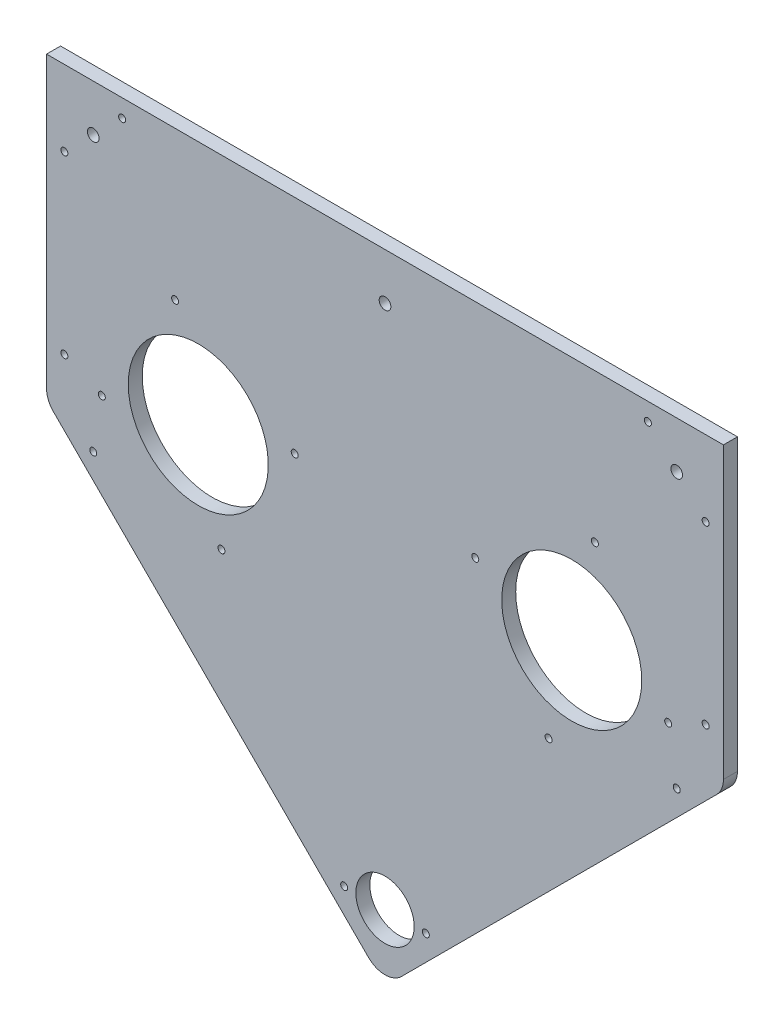
ISO-10303-21;
HEADER;
FILE_DESCRIPTION(('STEP AP214'),'2;1');
FILE_NAME('part.step','',(''),(''),'','','');
FILE_SCHEMA(('AUTOMOTIVE_DESIGN { 1 0 10303 214 1 1 1 1 }'));
ENDSEC;
DATA;
#1=APPLICATION_CONTEXT('core data for automotive mechanical design processes');
#2=APPLICATION_PROTOCOL_DEFINITION('international standard','automotive_design',2000,#1);
#3=PRODUCT_CONTEXT('',#1,'mechanical');
#4=PRODUCT('Part','Part','',(#3));
#5=PRODUCT_RELATED_PRODUCT_CATEGORY('part','',(#4));
#6=PRODUCT_DEFINITION_FORMATION('','',#4);
#7=PRODUCT_DEFINITION_CONTEXT('part definition',#1,'design');
#8=PRODUCT_DEFINITION('design','',#6,#7);
#9=PRODUCT_DEFINITION_SHAPE('','',#8);
#10=(LENGTH_UNIT() NAMED_UNIT(*) SI_UNIT(.MILLI.,.METRE.));
#11=(NAMED_UNIT(*) PLANE_ANGLE_UNIT() SI_UNIT($,.RADIAN.));
#12=(NAMED_UNIT(*) SI_UNIT($,.STERADIAN.) SOLID_ANGLE_UNIT());
#13=UNCERTAINTY_MEASURE_WITH_UNIT(LENGTH_MEASURE(1.E-05),#10,'distance_accuracy_value','');
#14=(GEOMETRIC_REPRESENTATION_CONTEXT(3) GLOBAL_UNCERTAINTY_ASSIGNED_CONTEXT((#13)) GLOBAL_UNIT_ASSIGNED_CONTEXT((#10,
#11,#12)) REPRESENTATION_CONTEXT('',''));
#15=CARTESIAN_POINT('',(0.,0.,0.));
#16=DIRECTION('',(0.,0.,1.));
#17=DIRECTION('',(1.,0.,0.));
#18=AXIS2_PLACEMENT_3D('',#15,#16,#17);
#19=CARTESIAN_POINT('',(0.,0.,6.));
#20=DIRECTION('',(0.,0.,-1.));
#21=DIRECTION('',(-1.,0.,0.));
#22=AXIS2_PLACEMENT_3D('',#19,#20,#21);
#23=PLANE('',#22);
#24=CARTESIAN_POINT('',(80.,15.,6.));
#25=DIRECTION('',(0.,0.,1.));
#26=DIRECTION('',(1.,0.,0.));
#27=AXIS2_PLACEMENT_3D('',#24,#25,#26);
#28=CIRCLE('',#27,30.);
#29=CARTESIAN_POINT('',(110.,15.,6.));
#30=VERTEX_POINT('',#29);
#31=EDGE_CURVE('E754',#30,#30,#28,.T.);
#32=ORIENTED_EDGE('',*,*,#31,.F.);
#33=EDGE_LOOP('',(#32));
#34=FACE_BOUND('',#33,.T.);
#35=CARTESIAN_POINT('',(-89.9203681970796,56.3259760300271,6.));
#36=DIRECTION('',(0.,0.,1.));
#37=DIRECTION('',(-1.,0.,0.));
#38=AXIS2_PLACEMENT_3D('',#35,#36,#37);
#39=CIRCLE('',#38,1.50000000000003);
#40=CARTESIAN_POINT('',(-91.4203681970796,56.3259760300271,6.));
#41=VERTEX_POINT('',#40);
#42=EDGE_CURVE('E758',#41,#41,#39,.T.);
#43=ORIENTED_EDGE('',*,*,#42,.F.);
#44=EDGE_LOOP('',(#43));
#45=FACE_BOUND('',#44,.T.);
#46=CARTESIAN_POINT('',(-70.0796318029204,-26.3259760300271,6.));
#47=DIRECTION('',(0.,0.,1.));
#48=DIRECTION('',(-1.,0.,0.));
#49=AXIS2_PLACEMENT_3D('',#46,#47,#48);
#50=CIRCLE('',#49,1.5);
#51=CARTESIAN_POINT('',(-71.5796318029204,-26.3259760300271,6.));
#52=VERTEX_POINT('',#51);
#53=EDGE_CURVE('E762',#52,#52,#50,.T.);
#54=ORIENTED_EDGE('',*,*,#53,.F.);
#55=EDGE_LOOP('',(#54));
#56=FACE_BOUND('',#55,.T.);
#57=CARTESIAN_POINT('',(-121.325976030027,5.07963180292047,6.));
#58=DIRECTION('',(0.,0.,1.));
#59=DIRECTION('',(-1.,0.,0.));
#60=AXIS2_PLACEMENT_3D('',#57,#58,#59);
#61=CIRCLE('',#60,1.5);
#62=CARTESIAN_POINT('',(-122.825976030027,5.07963180292047,6.));
#63=VERTEX_POINT('',#62);
#64=EDGE_CURVE('E766',#63,#63,#61,.T.);
#65=ORIENTED_EDGE('',*,*,#64,.F.);
#66=EDGE_LOOP('',(#65));
#67=FACE_BOUND('',#66,.T.);
#68=CARTESIAN_POINT('',(38.6740239699729,24.9203681970796,6.));
#69=DIRECTION('',(0.,0.,1.));
#70=DIRECTION('',(1.,0.,0.));
#71=AXIS2_PLACEMENT_3D('',#68,#69,#70);
#72=CIRCLE('',#71,1.50000000000003);
#73=CARTESIAN_POINT('',(40.1740239699729,24.9203681970796,6.));
#74=VERTEX_POINT('',#73);
#75=EDGE_CURVE('E740',#74,#74,#72,.T.);
#76=ORIENTED_EDGE('',*,*,#75,.F.);
#77=EDGE_LOOP('',(#76));
#78=FACE_BOUND('',#77,.T.);
#79=CARTESIAN_POINT('',(121.325976030027,5.07963180292047,6.));
#80=DIRECTION('',(0.,0.,1.));
#81=DIRECTION('',(1.,0.,0.));
#82=AXIS2_PLACEMENT_3D('',#79,#80,#81);
#83=CIRCLE('',#82,1.5);
#84=CARTESIAN_POINT('',(122.825976030027,5.07963180292047,6.));
#85=VERTEX_POINT('',#84);
#86=EDGE_CURVE('E743',#85,#85,#83,.T.);
#87=ORIENTED_EDGE('',*,*,#86,.F.);
#88=EDGE_LOOP('',(#87));
#89=FACE_BOUND('',#88,.T.);
#90=CARTESIAN_POINT('',(70.0796318029204,-26.3259760300271,6.));
#91=DIRECTION('',(0.,0.,1.));
#92=DIRECTION('',(1.,0.,0.));
#93=AXIS2_PLACEMENT_3D('',#90,#91,#92);
#94=CIRCLE('',#93,1.5);
#95=CARTESIAN_POINT('',(71.5796318029204,-26.3259760300271,6.));
#96=VERTEX_POINT('',#95);
#97=EDGE_CURVE('E748',#96,#96,#94,.T.);
#98=ORIENTED_EDGE('',*,*,#97,.F.);
#99=EDGE_LOOP('',(#98));
#100=FACE_BOUND('',#99,.T.);
#101=CARTESIAN_POINT('',(-38.6740239699729,24.9203681970796,6.));
#102=DIRECTION('',(0.,0.,1.));
#103=DIRECTION('',(-1.,0.,0.));
#104=AXIS2_PLACEMENT_3D('',#101,#102,#103);
#105=CIRCLE('',#104,1.50000000000003);
#106=CARTESIAN_POINT('',(-40.1740239699729,24.9203681970796,6.));
#107=VERTEX_POINT('',#106);
#108=EDGE_CURVE('E750',#107,#107,#105,.T.);
#109=ORIENTED_EDGE('',*,*,#108,.F.);
#110=EDGE_LOOP('',(#109));
#111=FACE_BOUND('',#110,.T.);
#112=CARTESIAN_POINT('',(-80.,15.,6.));
#113=DIRECTION('',(0.,0.,1.));
#114=DIRECTION('',(-1.,0.,0.));
#115=AXIS2_PLACEMENT_3D('',#112,#113,#114);
#116=CIRCLE('',#115,30.);
#117=CARTESIAN_POINT('',(-110.,15.,6.));
#118=VERTEX_POINT('',#117);
#119=EDGE_CURVE('E770',#118,#118,#116,.T.);
#120=ORIENTED_EDGE('',*,*,#119,.F.);
#121=EDGE_LOOP('',(#120));
#122=FACE_BOUND('',#121,.T.);
#123=CARTESIAN_POINT('',(89.9203681970796,56.3259760300271,6.));
#124=DIRECTION('',(0.,0.,1.));
#125=DIRECTION('',(1.,0.,0.));
#126=AXIS2_PLACEMENT_3D('',#123,#124,#125);
#127=CIRCLE('',#126,1.50000000000003);
#128=CARTESIAN_POINT('',(91.4203681970796,56.3259760300271,6.));
#129=VERTEX_POINT('',#128);
#130=EDGE_CURVE('E200',#129,#129,#127,.T.);
#131=ORIENTED_EDGE('',*,*,#130,.F.);
#132=EDGE_LOOP('',(#131));
#133=FACE_BOUND('',#132,.T.);
#134=DIRECTION('',(0.,-1.,0.));
#135=VECTOR('',#134,1.);
#136=CARTESIAN_POINT('',(-145.,-8.28427124746189,6.));
#137=LINE('',#136,#135);
#138=CARTESIAN_POINT('',(-145.,120.,6.));
#139=VERTEX_POINT('',#138);
#140=CARTESIAN_POINT('',(-145.,-4.14213562373095,6.));
#141=VERTEX_POINT('',#140);
#142=EDGE_CURVE('E161',#139,#141,#137,.T.);
#143=ORIENTED_EDGE('',*,*,#142,.T.);
#144=CARTESIAN_POINT('',(-135.,-4.14213562373095,6.));
#145=DIRECTION('',(0.,0.,-1.));
#146=DIRECTION('',(-1.,0.,0.));
#147=AXIS2_PLACEMENT_3D('',#144,#145,#146);
#148=CIRCLE('',#147,10.);
#149=CARTESIAN_POINT('',(-142.071067811865,-11.2132034355965,6.));
#150=VERTEX_POINT('',#149);
#151=EDGE_CURVE('E186',#141,#150,#148,.F.);
#152=ORIENTED_EDGE('',*,*,#151,.T.);
#153=DIRECTION('',(0.707106781186547,-0.707106781186547,0.));
#154=VECTOR('',#153,1.);
#155=CARTESIAN_POINT('',(0.,-153.284271247462,6.));
#156=LINE('',#155,#154);
#157=CARTESIAN_POINT('',(-7.07106781186548,-146.213203435596,6.));
#158=VERTEX_POINT('',#157);
#159=EDGE_CURVE('E353',#150,#158,#156,.T.);
#160=ORIENTED_EDGE('',*,*,#159,.T.);
#161=CARTESIAN_POINT('',(0.,-139.142135623731,6.));
#162=DIRECTION('',(0.,0.,-1.));
#163=DIRECTION('',(-1.,0.,0.));
#164=AXIS2_PLACEMENT_3D('',#161,#162,#163);
#165=CIRCLE('',#164,10.);
#166=CARTESIAN_POINT('',(7.07106781186545,-146.213203435596,6.));
#167=VERTEX_POINT('',#166);
#168=EDGE_CURVE('E181',#158,#167,#165,.F.);
#169=ORIENTED_EDGE('',*,*,#168,.T.);
#170=DIRECTION('',(0.707106781186548,0.707106781186547,0.));
#171=VECTOR('',#170,1.);
#172=CARTESIAN_POINT('',(145.,-8.28427124746206,6.));
#173=LINE('',#172,#171);
#174=CARTESIAN_POINT('',(142.071067811865,-11.2132034355966,6.));
#175=VERTEX_POINT('',#174);
#176=EDGE_CURVE('E123',#167,#175,#173,.T.);
#177=ORIENTED_EDGE('',*,*,#176,.T.);
#178=CARTESIAN_POINT('',(135.,-4.14213562373111,6.));
#179=DIRECTION('',(0.,0.,-1.));
#180=DIRECTION('',(-1.,0.,0.));
#181=AXIS2_PLACEMENT_3D('',#178,#179,#180);
#182=CIRCLE('',#181,10.);
#183=CARTESIAN_POINT('',(145.,-4.14213562373111,6.));
#184=VERTEX_POINT('',#183);
#185=EDGE_CURVE('E65',#175,#184,#182,.F.);
#186=ORIENTED_EDGE('',*,*,#185,.T.);
#187=DIRECTION('',(0.,1.,0.));
#188=VECTOR('',#187,1.);
#189=CARTESIAN_POINT('',(145.,120.,6.));
#190=LINE('',#189,#188);
#191=CARTESIAN_POINT('',(145.,120.,6.));
#192=VERTEX_POINT('',#191);
#193=EDGE_CURVE('E112',#184,#192,#190,.T.);
#194=ORIENTED_EDGE('',*,*,#193,.T.);
#195=DIRECTION('',(-1.,0.,0.));
#196=VECTOR('',#195,1.);
#197=CARTESIAN_POINT('',(-145.,120.,6.));
#198=LINE('',#197,#196);
#199=EDGE_CURVE('E117',#192,#139,#198,.T.);
#200=ORIENTED_EDGE('',*,*,#199,.T.);
#201=EDGE_LOOP('',(#143,#152,#160,#169,#177,#186,#194,#200));
#202=FACE_BOUND('',#201,.T.);
#203=CARTESIAN_POINT('',(-125.,100.,6.));
#204=DIRECTION('',(0.,0.,1.));
#205=DIRECTION('',(1.,0.,0.));
#206=AXIS2_PLACEMENT_3D('',#203,#204,#205);
#207=CIRCLE('',#206,2.5);
#208=CARTESIAN_POINT('',(-122.5,100.,6.));
#209=VERTEX_POINT('',#208);
#210=EDGE_CURVE('E150',#209,#209,#207,.T.);
#211=ORIENTED_EDGE('',*,*,#210,.F.);
#212=EDGE_LOOP('',(#211));
#213=FACE_BOUND('',#212,.T.);
#214=CARTESIAN_POINT('',(125.,100.,6.));
#215=DIRECTION('',(0.,0.,1.));
#216=DIRECTION('',(1.,0.,0.));
#217=AXIS2_PLACEMENT_3D('',#214,#215,#216);
#218=CIRCLE('',#217,2.49999999999998);
#219=CARTESIAN_POINT('',(127.5,100.,6.));
#220=VERTEX_POINT('',#219);
#221=EDGE_CURVE('E337',#220,#220,#218,.T.);
#222=ORIENTED_EDGE('',*,*,#221,.F.);
#223=EDGE_LOOP('',(#222));
#224=FACE_BOUND('',#223,.T.);
#225=CARTESIAN_POINT('',(0.,-125.,6.));
#226=DIRECTION('',(0.,0.,1.));
#227=DIRECTION('',(1.,0.,0.));
#228=AXIS2_PLACEMENT_3D('',#225,#226,#227);
#229=CIRCLE('',#228,12.5);
#230=CARTESIAN_POINT('',(12.5,-125.,6.));
#231=VERTEX_POINT('',#230);
#232=EDGE_CURVE('E329',#231,#231,#229,.T.);
#233=ORIENTED_EDGE('',*,*,#232,.F.);
#234=EDGE_LOOP('',(#233));
#235=FACE_BOUND('',#234,.T.);
#236=CARTESIAN_POINT('',(-112.625631329235,112.374368670765,6.));
#237=DIRECTION('',(0.,0.,1.));
#238=DIRECTION('',(1.,0.,0.));
#239=AXIS2_PLACEMENT_3D('',#236,#237,#238);
#240=CIRCLE('',#239,1.5);
#241=CARTESIAN_POINT('',(-111.125631329235,112.374368670765,6.));
#242=VERTEX_POINT('',#241);
#243=EDGE_CURVE('E321',#242,#242,#240,.T.);
#244=ORIENTED_EDGE('',*,*,#243,.F.);
#245=EDGE_LOOP('',(#244));
#246=FACE_BOUND('',#245,.T.);
#247=CARTESIAN_POINT('',(-137.374368670765,87.6256313292354,6.));
#248=DIRECTION('',(0.,0.,1.));
#249=DIRECTION('',(1.,0.,0.));
#250=AXIS2_PLACEMENT_3D('',#247,#248,#249);
#251=CIRCLE('',#250,1.5);
#252=CARTESIAN_POINT('',(-135.874368670765,87.6256313292354,6.));
#253=VERTEX_POINT('',#252);
#254=EDGE_CURVE('E313',#253,#253,#251,.T.);
#255=ORIENTED_EDGE('',*,*,#254,.F.);
#256=EDGE_LOOP('',(#255));
#257=FACE_BOUND('',#256,.T.);
#258=CARTESIAN_POINT('',(-137.374368670765,12.3743686707647,6.));
#259=DIRECTION('',(0.,0.,1.));
#260=DIRECTION('',(1.,0.,0.));
#261=AXIS2_PLACEMENT_3D('',#258,#259,#260);
#262=CIRCLE('',#261,1.5);
#263=CARTESIAN_POINT('',(-135.874368670765,12.3743686707647,6.));
#264=VERTEX_POINT('',#263);
#265=EDGE_CURVE('E305',#264,#264,#262,.T.);
#266=ORIENTED_EDGE('',*,*,#265,.F.);
#267=EDGE_LOOP('',(#266));
#268=FACE_BOUND('',#267,.T.);
#269=CARTESIAN_POINT('',(-125.,-17.5,6.));
#270=DIRECTION('',(0.,0.,1.));
#271=DIRECTION('',(1.,0.,0.));
#272=AXIS2_PLACEMENT_3D('',#269,#270,#271);
#273=CIRCLE('',#272,1.5);
#274=CARTESIAN_POINT('',(-123.5,-17.5,6.));
#275=VERTEX_POINT('',#274);
#276=EDGE_CURVE('E297',#275,#275,#273,.T.);
#277=ORIENTED_EDGE('',*,*,#276,.F.);
#278=EDGE_LOOP('',(#277));
#279=FACE_BOUND('',#278,.T.);
#280=CARTESIAN_POINT('',(-17.5,-125.,6.));
#281=DIRECTION('',(0.,0.,1.));
#282=DIRECTION('',(1.,0.,0.));
#283=AXIS2_PLACEMENT_3D('',#280,#281,#282);
#284=CIRCLE('',#283,1.5);
#285=CARTESIAN_POINT('',(-16.,-125.,6.));
#286=VERTEX_POINT('',#285);
#287=EDGE_CURVE('E289',#286,#286,#284,.T.);
#288=ORIENTED_EDGE('',*,*,#287,.F.);
#289=EDGE_LOOP('',(#288));
#290=FACE_BOUND('',#289,.T.);
#291=CARTESIAN_POINT('',(17.5,-125.,6.));
#292=DIRECTION('',(0.,0.,1.));
#293=DIRECTION('',(-1.,0.,0.));
#294=AXIS2_PLACEMENT_3D('',#291,#292,#293);
#295=CIRCLE('',#294,1.5);
#296=CARTESIAN_POINT('',(16.,-125.,6.));
#297=VERTEX_POINT('',#296);
#298=EDGE_CURVE('E281',#297,#297,#295,.T.);
#299=ORIENTED_EDGE('',*,*,#298,.F.);
#300=EDGE_LOOP('',(#299));
#301=FACE_BOUND('',#300,.T.);
#302=CARTESIAN_POINT('',(125.,-17.5,6.));
#303=DIRECTION('',(0.,0.,1.));
#304=DIRECTION('',(-1.,0.,0.));
#305=AXIS2_PLACEMENT_3D('',#302,#303,#304);
#306=CIRCLE('',#305,1.5);
#307=CARTESIAN_POINT('',(123.5,-17.5,6.));
#308=VERTEX_POINT('',#307);
#309=EDGE_CURVE('E273',#308,#308,#306,.T.);
#310=ORIENTED_EDGE('',*,*,#309,.F.);
#311=EDGE_LOOP('',(#310));
#312=FACE_BOUND('',#311,.T.);
#313=CARTESIAN_POINT('',(137.374368670765,12.3743686707647,6.));
#314=DIRECTION('',(0.,0.,1.));
#315=DIRECTION('',(-1.,0.,0.));
#316=AXIS2_PLACEMENT_3D('',#313,#314,#315);
#317=CIRCLE('',#316,1.5);
#318=CARTESIAN_POINT('',(135.874368670765,12.3743686707647,6.));
#319=VERTEX_POINT('',#318);
#320=EDGE_CURVE('E265',#319,#319,#317,.T.);
#321=ORIENTED_EDGE('',*,*,#320,.F.);
#322=EDGE_LOOP('',(#321));
#323=FACE_BOUND('',#322,.T.);
#324=CARTESIAN_POINT('',(137.374368670765,87.6256313292354,6.));
#325=DIRECTION('',(0.,0.,1.));
#326=DIRECTION('',(-1.,0.,0.));
#327=AXIS2_PLACEMENT_3D('',#324,#325,#326);
#328=CIRCLE('',#327,1.5);
#329=CARTESIAN_POINT('',(135.874368670765,87.6256313292354,6.));
#330=VERTEX_POINT('',#329);
#331=EDGE_CURVE('E257',#330,#330,#328,.T.);
#332=ORIENTED_EDGE('',*,*,#331,.F.);
#333=EDGE_LOOP('',(#332));
#334=FACE_BOUND('',#333,.T.);
#335=CARTESIAN_POINT('',(112.625631329235,112.374368670765,6.));
#336=DIRECTION('',(0.,0.,1.));
#337=DIRECTION('',(-1.,0.,0.));
#338=AXIS2_PLACEMENT_3D('',#335,#336,#337);
#339=CIRCLE('',#338,1.5);
#340=CARTESIAN_POINT('',(111.125631329235,112.374368670765,6.));
#341=VERTEX_POINT('',#340);
#342=EDGE_CURVE('E249',#341,#341,#339,.T.);
#343=ORIENTED_EDGE('',*,*,#342,.F.);
#344=EDGE_LOOP('',(#343));
#345=FACE_BOUND('',#344,.T.);
#346=CARTESIAN_POINT('',(0.,100.,6.));
#347=DIRECTION('',(0.,0.,1.));
#348=DIRECTION('',(1.,0.,0.));
#349=AXIS2_PLACEMENT_3D('',#346,#347,#348);
#350=CIRCLE('',#349,2.5);
#351=CARTESIAN_POINT('',(2.5,100.,6.));
#352=VERTEX_POINT('',#351);
#353=EDGE_CURVE('E239',#352,#352,#350,.T.);
#354=ORIENTED_EDGE('',*,*,#353,.F.);
#355=EDGE_LOOP('',(#354));
#356=FACE_BOUND('',#355,.T.);
#357=ADVANCED_FACE('F47',(#34,#45,#56,#67,#78,#89,#100,#111,#122,#133,#202,#213,#224,#235,#246,
#257,#268,#279,#290,#301,#312,#323,#334,#345,#356),#23,.F.);
#358=CARTESIAN_POINT('',(0.,0.,0.));
#359=DIRECTION('',(0.,0.,-1.));
#360=DIRECTION('',(-1.,0.,0.));
#361=AXIS2_PLACEMENT_3D('',#358,#359,#360);
#362=PLANE('',#361);
#363=CARTESIAN_POINT('',(80.,15.,0.));
#364=DIRECTION('',(0.,0.,-1.));
#365=DIRECTION('',(-1.,0.,0.));
#366=AXIS2_PLACEMENT_3D('',#363,#364,#365);
#367=CIRCLE('',#366,30.);
#368=CARTESIAN_POINT('',(50.,15.,0.));
#369=VERTEX_POINT('',#368);
#370=EDGE_CURVE('E51',#369,#369,#367,.T.);
#371=ORIENTED_EDGE('',*,*,#370,.F.);
#372=EDGE_LOOP('',(#371));
#373=FACE_BOUND('',#372,.T.);
#374=CARTESIAN_POINT('',(-89.9203681970796,56.3259760300271,0.));
#375=DIRECTION('',(0.,0.,-1.));
#376=DIRECTION('',(-1.,0.,0.));
#377=AXIS2_PLACEMENT_3D('',#374,#375,#376);
#378=CIRCLE('',#377,1.50000000000003);
#379=CARTESIAN_POINT('',(-91.4203681970796,56.3259760300271,0.));
#380=VERTEX_POINT('',#379);
#381=EDGE_CURVE('E227',#380,#380,#378,.T.);
#382=ORIENTED_EDGE('',*,*,#381,.F.);
#383=EDGE_LOOP('',(#382));
#384=FACE_BOUND('',#383,.T.);
#385=CARTESIAN_POINT('',(-70.0796318029204,-26.3259760300271,0.));
#386=DIRECTION('',(0.,0.,-1.));
#387=DIRECTION('',(-1.,0.,0.));
#388=AXIS2_PLACEMENT_3D('',#385,#386,#387);
#389=CIRCLE('',#388,1.5);
#390=CARTESIAN_POINT('',(-71.5796318029204,-26.3259760300271,0.));
#391=VERTEX_POINT('',#390);
#392=EDGE_CURVE('E224',#391,#391,#389,.T.);
#393=ORIENTED_EDGE('',*,*,#392,.F.);
#394=EDGE_LOOP('',(#393));
#395=FACE_BOUND('',#394,.T.);
#396=CARTESIAN_POINT('',(-121.325976030027,5.07963180292047,0.));
#397=DIRECTION('',(0.,0.,-1.));
#398=DIRECTION('',(-1.,0.,0.));
#399=AXIS2_PLACEMENT_3D('',#396,#397,#398);
#400=CIRCLE('',#399,1.5);
#401=CARTESIAN_POINT('',(-122.825976030027,5.07963180292047,0.));
#402=VERTEX_POINT('',#401);
#403=EDGE_CURVE('E220',#402,#402,#400,.T.);
#404=ORIENTED_EDGE('',*,*,#403,.F.);
#405=EDGE_LOOP('',(#404));
#406=FACE_BOUND('',#405,.T.);
#407=CARTESIAN_POINT('',(38.6740239699729,24.9203681970796,0.));
#408=DIRECTION('',(0.,0.,-1.));
#409=DIRECTION('',(-1.,0.,0.));
#410=AXIS2_PLACEMENT_3D('',#407,#408,#409);
#411=CIRCLE('',#410,1.50000000000003);
#412=CARTESIAN_POINT('',(37.1740239699729,24.9203681970796,0.));
#413=VERTEX_POINT('',#412);
#414=EDGE_CURVE('E216',#413,#413,#411,.T.);
#415=ORIENTED_EDGE('',*,*,#414,.F.);
#416=EDGE_LOOP('',(#415));
#417=FACE_BOUND('',#416,.T.);
#418=CARTESIAN_POINT('',(121.325976030027,5.07963180292047,0.));
#419=DIRECTION('',(0.,0.,-1.));
#420=DIRECTION('',(-1.,0.,0.));
#421=AXIS2_PLACEMENT_3D('',#418,#419,#420);
#422=CIRCLE('',#421,1.5);
#423=CARTESIAN_POINT('',(119.825976030027,5.07963180292047,0.));
#424=VERTEX_POINT('',#423);
#425=EDGE_CURVE('E212',#424,#424,#422,.T.);
#426=ORIENTED_EDGE('',*,*,#425,.F.);
#427=EDGE_LOOP('',(#426));
#428=FACE_BOUND('',#427,.T.);
#429=CARTESIAN_POINT('',(70.0796318029204,-26.3259760300271,0.));
#430=DIRECTION('',(0.,0.,-1.));
#431=DIRECTION('',(-1.,0.,0.));
#432=AXIS2_PLACEMENT_3D('',#429,#430,#431);
#433=CIRCLE('',#432,1.5);
#434=CARTESIAN_POINT('',(68.5796318029204,-26.3259760300271,0.));
#435=VERTEX_POINT('',#434);
#436=EDGE_CURVE('E208',#435,#435,#433,.T.);
#437=ORIENTED_EDGE('',*,*,#436,.F.);
#438=EDGE_LOOP('',(#437));
#439=FACE_BOUND('',#438,.T.);
#440=CARTESIAN_POINT('',(-38.6740239699729,24.9203681970796,0.));
#441=DIRECTION('',(0.,0.,-1.));
#442=DIRECTION('',(-1.,0.,0.));
#443=AXIS2_PLACEMENT_3D('',#440,#441,#442);
#444=CIRCLE('',#443,1.50000000000003);
#445=CARTESIAN_POINT('',(-40.1740239699729,24.9203681970796,0.));
#446=VERTEX_POINT('',#445);
#447=EDGE_CURVE('E204',#446,#446,#444,.T.);
#448=ORIENTED_EDGE('',*,*,#447,.F.);
#449=EDGE_LOOP('',(#448));
#450=FACE_BOUND('',#449,.T.);
#451=CARTESIAN_POINT('',(-80.,15.,0.));
#452=DIRECTION('',(0.,0.,-1.));
#453=DIRECTION('',(-1.,0.,0.));
#454=AXIS2_PLACEMENT_3D('',#451,#452,#453);
#455=CIRCLE('',#454,30.);
#456=CARTESIAN_POINT('',(-110.,15.,0.));
#457=VERTEX_POINT('',#456);
#458=EDGE_CURVE('E199',#457,#457,#455,.T.);
#459=ORIENTED_EDGE('',*,*,#458,.F.);
#460=EDGE_LOOP('',(#459));
#461=FACE_BOUND('',#460,.T.);
#462=CARTESIAN_POINT('',(89.9203681970796,56.3259760300271,0.));
#463=DIRECTION('',(0.,0.,-1.));
#464=DIRECTION('',(-1.,0.,0.));
#465=AXIS2_PLACEMENT_3D('',#462,#463,#464);
#466=CIRCLE('',#465,1.50000000000003);
#467=CARTESIAN_POINT('',(88.4203681970795,56.3259760300271,0.));
#468=VERTEX_POINT('',#467);
#469=EDGE_CURVE('E195',#468,#468,#466,.T.);
#470=ORIENTED_EDGE('',*,*,#469,.F.);
#471=EDGE_LOOP('',(#470));
#472=FACE_BOUND('',#471,.T.);
#473=CARTESIAN_POINT('',(112.625631329235,112.374368670765,0.));
#474=DIRECTION('',(0.,0.,1.));
#475=DIRECTION('',(-1.,0.,0.));
#476=AXIS2_PLACEMENT_3D('',#473,#474,#475);
#477=CIRCLE('',#476,1.5);
#478=CARTESIAN_POINT('',(111.125631329235,112.374368670765,0.));
#479=VERTEX_POINT('',#478);
#480=EDGE_CURVE('E245',#479,#479,#477,.T.);
#481=ORIENTED_EDGE('',*,*,#480,.T.);
#482=EDGE_LOOP('',(#481));
#483=FACE_BOUND('',#482,.T.);
#484=CARTESIAN_POINT('',(137.374368670765,12.3743686707647,0.));
#485=DIRECTION('',(0.,0.,1.));
#486=DIRECTION('',(-1.,0.,0.));
#487=AXIS2_PLACEMENT_3D('',#484,#485,#486);
#488=CIRCLE('',#487,1.5);
#489=CARTESIAN_POINT('',(135.874368670765,12.3743686707647,0.));
#490=VERTEX_POINT('',#489);
#491=EDGE_CURVE('E261',#490,#490,#488,.T.);
#492=ORIENTED_EDGE('',*,*,#491,.T.);
#493=EDGE_LOOP('',(#492));
#494=FACE_BOUND('',#493,.T.);
#495=CARTESIAN_POINT('',(17.5,-125.,0.));
#496=DIRECTION('',(0.,0.,1.));
#497=DIRECTION('',(-1.,0.,0.));
#498=AXIS2_PLACEMENT_3D('',#495,#496,#497);
#499=CIRCLE('',#498,1.5);
#500=CARTESIAN_POINT('',(16.,-125.,0.));
#501=VERTEX_POINT('',#500);
#502=EDGE_CURVE('E277',#501,#501,#499,.T.);
#503=ORIENTED_EDGE('',*,*,#502,.T.);
#504=EDGE_LOOP('',(#503));
#505=FACE_BOUND('',#504,.T.);
#506=CARTESIAN_POINT('',(-125.,-17.5,0.));
#507=DIRECTION('',(0.,0.,1.));
#508=DIRECTION('',(1.,0.,0.));
#509=AXIS2_PLACEMENT_3D('',#506,#507,#508);
#510=CIRCLE('',#509,1.5);
#511=CARTESIAN_POINT('',(-123.5,-17.5,0.));
#512=VERTEX_POINT('',#511);
#513=EDGE_CURVE('E293',#512,#512,#510,.T.);
#514=ORIENTED_EDGE('',*,*,#513,.T.);
#515=EDGE_LOOP('',(#514));
#516=FACE_BOUND('',#515,.T.);
#517=CARTESIAN_POINT('',(-137.374368670765,87.6256313292354,0.));
#518=DIRECTION('',(0.,0.,1.));
#519=DIRECTION('',(1.,0.,0.));
#520=AXIS2_PLACEMENT_3D('',#517,#518,#519);
#521=CIRCLE('',#520,1.5);
#522=CARTESIAN_POINT('',(-135.874368670765,87.6256313292354,0.));
#523=VERTEX_POINT('',#522);
#524=EDGE_CURVE('E309',#523,#523,#521,.T.);
#525=ORIENTED_EDGE('',*,*,#524,.T.);
#526=EDGE_LOOP('',(#525));
#527=FACE_BOUND('',#526,.T.);
#528=CARTESIAN_POINT('',(0.,-125.,0.));
#529=DIRECTION('',(0.,0.,1.));
#530=DIRECTION('',(1.,0.,0.));
#531=AXIS2_PLACEMENT_3D('',#528,#529,#530);
#532=CIRCLE('',#531,12.5);
#533=CARTESIAN_POINT('',(12.5,-125.,0.));
#534=VERTEX_POINT('',#533);
#535=EDGE_CURVE('E325',#534,#534,#532,.T.);
#536=ORIENTED_EDGE('',*,*,#535,.T.);
#537=EDGE_LOOP('',(#536));
#538=FACE_BOUND('',#537,.T.);
#539=CARTESIAN_POINT('',(-125.,100.,0.));
#540=DIRECTION('',(0.,0.,1.));
#541=DIRECTION('',(1.,0.,0.));
#542=AXIS2_PLACEMENT_3D('',#539,#540,#541);
#543=CIRCLE('',#542,2.5);
#544=CARTESIAN_POINT('',(-122.5,100.,0.));
#545=VERTEX_POINT('',#544);
#546=EDGE_CURVE('E341',#545,#545,#543,.T.);
#547=ORIENTED_EDGE('',*,*,#546,.T.);
#548=EDGE_LOOP('',(#547));
#549=FACE_BOUND('',#548,.T.);
#550=DIRECTION('',(0.707106781186547,-0.707106781186547,0.));
#551=VECTOR('',#550,1.);
#552=CARTESIAN_POINT('',(0.,-153.284271247462,0.));
#553=LINE('',#552,#551);
#554=CARTESIAN_POINT('',(-142.071067811865,-11.2132034355965,0.));
#555=VERTEX_POINT('',#554);
#556=CARTESIAN_POINT('',(-7.07106781186548,-146.213203435596,0.));
#557=VERTEX_POINT('',#556);
#558=EDGE_CURVE('E149',#555,#557,#553,.T.);
#559=ORIENTED_EDGE('',*,*,#558,.F.);
#560=CARTESIAN_POINT('',(-135.,-4.14213562373095,0.));
#561=DIRECTION('',(0.,0.,-1.));
#562=DIRECTION('',(-1.,0.,0.));
#563=AXIS2_PLACEMENT_3D('',#560,#561,#562);
#564=CIRCLE('',#563,10.);
#565=CARTESIAN_POINT('',(-145.,-4.14213562373095,0.));
#566=VERTEX_POINT('',#565);
#567=EDGE_CURVE('E175',#555,#566,#564,.T.);
#568=ORIENTED_EDGE('',*,*,#567,.T.);
#569=DIRECTION('',(0.,-1.,0.));
#570=VECTOR('',#569,1.);
#571=CARTESIAN_POINT('',(-145.,-8.28427124746189,0.));
#572=LINE('',#571,#570);
#573=CARTESIAN_POINT('',(-145.,120.,0.));
#574=VERTEX_POINT('',#573);
#575=EDGE_CURVE('E145',#574,#566,#572,.T.);
#576=ORIENTED_EDGE('',*,*,#575,.F.);
#577=DIRECTION('',(-1.,0.,0.));
#578=VECTOR('',#577,1.);
#579=CARTESIAN_POINT('',(-145.,120.,0.));
#580=LINE('',#579,#578);
#581=CARTESIAN_POINT('',(145.,120.,0.));
#582=VERTEX_POINT('',#581);
#583=EDGE_CURVE('E159',#582,#574,#580,.T.);
#584=ORIENTED_EDGE('',*,*,#583,.F.);
#585=DIRECTION('',(0.,1.,0.));
#586=VECTOR('',#585,1.);
#587=CARTESIAN_POINT('',(145.,120.,0.));
#588=LINE('',#587,#586);
#589=CARTESIAN_POINT('',(145.,-4.14213562373111,0.));
#590=VERTEX_POINT('',#589);
#591=EDGE_CURVE('E129',#590,#582,#588,.T.);
#592=ORIENTED_EDGE('',*,*,#591,.F.);
#593=CARTESIAN_POINT('',(135.,-4.14213562373111,0.));
#594=DIRECTION('',(0.,0.,-1.));
#595=DIRECTION('',(-1.,0.,0.));
#596=AXIS2_PLACEMENT_3D('',#593,#594,#595);
#597=CIRCLE('',#596,10.);
#598=CARTESIAN_POINT('',(142.071067811865,-11.2132034355966,0.));
#599=VERTEX_POINT('',#598);
#600=EDGE_CURVE('E172',#590,#599,#597,.T.);
#601=ORIENTED_EDGE('',*,*,#600,.T.);
#602=DIRECTION('',(0.707106781186548,0.707106781186547,0.));
#603=VECTOR('',#602,1.);
#604=CARTESIAN_POINT('',(145.,-8.28427124746206,0.));
#605=LINE('',#604,#603);
#606=CARTESIAN_POINT('',(7.07106781186545,-146.213203435596,0.));
#607=VERTEX_POINT('',#606);
#608=EDGE_CURVE('E154',#607,#599,#605,.T.);
#609=ORIENTED_EDGE('',*,*,#608,.F.);
#610=CARTESIAN_POINT('',(0.,-139.142135623731,0.));
#611=DIRECTION('',(0.,0.,-1.));
#612=DIRECTION('',(-1.,0.,0.));
#613=AXIS2_PLACEMENT_3D('',#610,#611,#612);
#614=CIRCLE('',#613,10.);
#615=EDGE_CURVE('E169',#607,#557,#614,.T.);
#616=ORIENTED_EDGE('',*,*,#615,.T.);
#617=EDGE_LOOP('',(#559,#568,#576,#584,#592,#601,#609,#616));
#618=FACE_BOUND('',#617,.T.);
#619=CARTESIAN_POINT('',(125.,100.,0.));
#620=DIRECTION('',(0.,0.,1.));
#621=DIRECTION('',(1.,0.,0.));
#622=AXIS2_PLACEMENT_3D('',#619,#620,#621);
#623=CIRCLE('',#622,2.49999999999998);
#624=CARTESIAN_POINT('',(127.5,100.,0.));
#625=VERTEX_POINT('',#624);
#626=EDGE_CURVE('E333',#625,#625,#623,.T.);
#627=ORIENTED_EDGE('',*,*,#626,.T.);
#628=EDGE_LOOP('',(#627));
#629=FACE_BOUND('',#628,.T.);
#630=CARTESIAN_POINT('',(-112.625631329235,112.374368670765,0.));
#631=DIRECTION('',(0.,0.,1.));
#632=DIRECTION('',(1.,0.,0.));
#633=AXIS2_PLACEMENT_3D('',#630,#631,#632);
#634=CIRCLE('',#633,1.5);
#635=CARTESIAN_POINT('',(-111.125631329235,112.374368670765,0.));
#636=VERTEX_POINT('',#635);
#637=EDGE_CURVE('E317',#636,#636,#634,.T.);
#638=ORIENTED_EDGE('',*,*,#637,.T.);
#639=EDGE_LOOP('',(#638));
#640=FACE_BOUND('',#639,.T.);
#641=CARTESIAN_POINT('',(-137.374368670765,12.3743686707647,0.));
#642=DIRECTION('',(0.,0.,1.));
#643=DIRECTION('',(1.,0.,0.));
#644=AXIS2_PLACEMENT_3D('',#641,#642,#643);
#645=CIRCLE('',#644,1.5);
#646=CARTESIAN_POINT('',(-135.874368670765,12.3743686707647,0.));
#647=VERTEX_POINT('',#646);
#648=EDGE_CURVE('E301',#647,#647,#645,.T.);
#649=ORIENTED_EDGE('',*,*,#648,.T.);
#650=EDGE_LOOP('',(#649));
#651=FACE_BOUND('',#650,.T.);
#652=CARTESIAN_POINT('',(-17.5,-125.,0.));
#653=DIRECTION('',(0.,0.,1.));
#654=DIRECTION('',(1.,0.,0.));
#655=AXIS2_PLACEMENT_3D('',#652,#653,#654);
#656=CIRCLE('',#655,1.5);
#657=CARTESIAN_POINT('',(-16.,-125.,0.));
#658=VERTEX_POINT('',#657);
#659=EDGE_CURVE('E285',#658,#658,#656,.T.);
#660=ORIENTED_EDGE('',*,*,#659,.T.);
#661=EDGE_LOOP('',(#660));
#662=FACE_BOUND('',#661,.T.);
#663=CARTESIAN_POINT('',(125.,-17.5,0.));
#664=DIRECTION('',(0.,0.,1.));
#665=DIRECTION('',(-1.,0.,0.));
#666=AXIS2_PLACEMENT_3D('',#663,#664,#665);
#667=CIRCLE('',#666,1.5);
#668=CARTESIAN_POINT('',(123.5,-17.5,0.));
#669=VERTEX_POINT('',#668);
#670=EDGE_CURVE('E269',#669,#669,#667,.T.);
#671=ORIENTED_EDGE('',*,*,#670,.T.);
#672=EDGE_LOOP('',(#671));
#673=FACE_BOUND('',#672,.T.);
#674=CARTESIAN_POINT('',(137.374368670765,87.6256313292354,0.));
#675=DIRECTION('',(0.,0.,1.));
#676=DIRECTION('',(-1.,0.,0.));
#677=AXIS2_PLACEMENT_3D('',#674,#675,#676);
#678=CIRCLE('',#677,1.5);
#679=CARTESIAN_POINT('',(135.874368670765,87.6256313292354,0.));
#680=VERTEX_POINT('',#679);
#681=EDGE_CURVE('E253',#680,#680,#678,.T.);
#682=ORIENTED_EDGE('',*,*,#681,.T.);
#683=EDGE_LOOP('',(#682));
#684=FACE_BOUND('',#683,.T.);
#685=CARTESIAN_POINT('',(0.,100.,0.));
#686=DIRECTION('',(0.,0.,1.));
#687=DIRECTION('',(1.,0.,0.));
#688=AXIS2_PLACEMENT_3D('',#685,#686,#687);
#689=CIRCLE('',#688,2.5);
#690=CARTESIAN_POINT('',(2.5,100.,0.));
#691=VERTEX_POINT('',#690);
#692=EDGE_CURVE('E234',#691,#691,#689,.T.);
#693=ORIENTED_EDGE('',*,*,#692,.T.);
#694=EDGE_LOOP('',(#693));
#695=FACE_BOUND('',#694,.T.);
#696=ADVANCED_FACE('F363',(#373,#384,#395,#406,#417,#428,#439,#450,#461,#472,#483,#494,#505,
#516,#527,#538,#549,#618,#629,#640,#651,#662,#673,#684,#695),#362,.T.);
#697=CARTESIAN_POINT('',(-145.,-8.28427124746189,6.));
#698=DIRECTION('',(1.,0.,0.));
#699=DIRECTION('',(0.,0.,-1.));
#700=AXIS2_PLACEMENT_3D('',#697,#698,#699);
#701=PLANE('',#700);
#702=ORIENTED_EDGE('',*,*,#575,.T.);
#703=DIRECTION('',(0.,0.,-1.));
#704=VECTOR('',#703,1.);
#705=CARTESIAN_POINT('',(-145.,-4.14213562373095,6.));
#706=LINE('',#705,#704);
#707=EDGE_CURVE('E178',#566,#141,#706,.F.);
#708=ORIENTED_EDGE('',*,*,#707,.T.);
#709=ORIENTED_EDGE('',*,*,#142,.F.);
#710=DIRECTION('',(0.,0.,-1.));
#711=VECTOR('',#710,1.);
#712=CARTESIAN_POINT('',(-145.,120.,6.));
#713=LINE('',#712,#711);
#714=EDGE_CURVE('E134',#139,#574,#713,.T.);
#715=ORIENTED_EDGE('',*,*,#714,.T.);
#716=EDGE_LOOP('',(#702,#708,#709,#715));
#717=FACE_BOUND('',#716,.T.);
#718=ADVANCED_FACE('F368',(#717),#701,.F.);
#719=CARTESIAN_POINT('',(0.,-153.284271247462,6.));
#720=DIRECTION('',(0.707106781186547,0.707106781186548,0.));
#721=DIRECTION('',(-0.707106781186548,0.707106781186547,0.));
#722=AXIS2_PLACEMENT_3D('',#719,#720,#721);
#723=PLANE('',#722);
#724=ORIENTED_EDGE('',*,*,#159,.F.);
#725=DIRECTION('',(0.,0.,-1.));
#726=VECTOR('',#725,1.);
#727=CARTESIAN_POINT('',(-142.071067811865,-11.2132034355964,6.));
#728=LINE('',#727,#726);
#729=EDGE_CURVE('E165',#150,#555,#728,.T.);
#730=ORIENTED_EDGE('',*,*,#729,.T.);
#731=ORIENTED_EDGE('',*,*,#558,.T.);
#732=DIRECTION('',(0.,0.,-1.));
#733=VECTOR('',#732,1.);
#734=CARTESIAN_POINT('',(-7.07106781186548,-146.213203435596,6.));
#735=LINE('',#734,#733);
#736=EDGE_CURVE('E133',#557,#158,#735,.F.);
#737=ORIENTED_EDGE('',*,*,#736,.T.);
#738=EDGE_LOOP('',(#724,#730,#731,#737));
#739=FACE_BOUND('',#738,.T.);
#740=ADVANCED_FACE('F376',(#739),#723,.F.);
#741=CARTESIAN_POINT('',(145.,-8.28427124746206,6.));
#742=DIRECTION('',(-0.707106781186547,0.707106781186548,0.));
#743=DIRECTION('',(-0.707106781186548,-0.707106781186547,0.));
#744=AXIS2_PLACEMENT_3D('',#741,#742,#743);
#745=PLANE('',#744);
#746=ORIENTED_EDGE('',*,*,#608,.T.);
#747=DIRECTION('',(0.,0.,-1.));
#748=VECTOR('',#747,1.);
#749=CARTESIAN_POINT('',(142.071067811865,-11.2132034355966,6.));
#750=LINE('',#749,#748);
#751=EDGE_CURVE('E11',#599,#175,#750,.F.);
#752=ORIENTED_EDGE('',*,*,#751,.T.);
#753=ORIENTED_EDGE('',*,*,#176,.F.);
#754=DIRECTION('',(0.,0.,-1.));
#755=VECTOR('',#754,1.);
#756=CARTESIAN_POINT('',(7.07106781186548,-146.213203435596,6.));
#757=LINE('',#756,#755);
#758=EDGE_CURVE('E57',#167,#607,#757,.T.);
#759=ORIENTED_EDGE('',*,*,#758,.T.);
#760=EDGE_LOOP('',(#746,#752,#753,#759));
#761=FACE_BOUND('',#760,.T.);
#762=ADVANCED_FACE('F379',(#761),#745,.F.);
#763=CARTESIAN_POINT('',(145.,120.,6.));
#764=DIRECTION('',(-1.,0.,0.));
#765=DIRECTION('',(0.,0.,1.));
#766=AXIS2_PLACEMENT_3D('',#763,#764,#765);
#767=PLANE('',#766);
#768=ORIENTED_EDGE('',*,*,#193,.F.);
#769=DIRECTION('',(0.,0.,-1.));
#770=VECTOR('',#769,1.);
#771=CARTESIAN_POINT('',(145.,-4.14213562373111,6.));
#772=LINE('',#771,#770);
#773=EDGE_CURVE('E189',#184,#590,#772,.T.);
#774=ORIENTED_EDGE('',*,*,#773,.T.);
#775=ORIENTED_EDGE('',*,*,#591,.T.);
#776=DIRECTION('',(0.,0.,-1.));
#777=VECTOR('',#776,1.);
#778=CARTESIAN_POINT('',(145.,120.,6.));
#779=LINE('',#778,#777);
#780=EDGE_CURVE('E126',#192,#582,#779,.T.);
#781=ORIENTED_EDGE('',*,*,#780,.F.);
#782=EDGE_LOOP('',(#768,#774,#775,#781));
#783=FACE_BOUND('',#782,.T.);
#784=ADVANCED_FACE('F127',(#783),#767,.F.);
#785=CARTESIAN_POINT('',(-145.,120.,6.));
#786=DIRECTION('',(0.,-1.,0.));
#787=DIRECTION('',(0.,0.,-1.));
#788=AXIS2_PLACEMENT_3D('',#785,#786,#787);
#789=PLANE('',#788);
#790=ORIENTED_EDGE('',*,*,#583,.T.);
#791=ORIENTED_EDGE('',*,*,#714,.F.);
#792=ORIENTED_EDGE('',*,*,#199,.F.);
#793=ORIENTED_EDGE('',*,*,#780,.T.);
#794=EDGE_LOOP('',(#790,#791,#792,#793));
#795=FACE_BOUND('',#794,.T.);
#796=ADVANCED_FACE('F136',(#795),#789,.F.);
#797=CARTESIAN_POINT('',(-125.,100.,6.));
#798=DIRECTION('',(0.,0.,-1.));
#799=DIRECTION('',(-1.,0.,0.));
#800=AXIS2_PLACEMENT_3D('',#797,#798,#799);
#801=CYLINDRICAL_SURFACE('',#800,2.5);
#802=ORIENTED_EDGE('',*,*,#210,.T.);
#803=EDGE_LOOP('',(#802));
#804=FACE_BOUND('',#803,.T.);
#805=ORIENTED_EDGE('',*,*,#546,.F.);
#806=EDGE_LOOP('',(#805));
#807=FACE_BOUND('',#806,.T.);
#808=ADVANCED_FACE('F401',(#804,#807),#801,.F.);
#809=CARTESIAN_POINT('',(125.,100.,6.));
#810=DIRECTION('',(0.,0.,-1.));
#811=DIRECTION('',(-1.,0.,0.));
#812=AXIS2_PLACEMENT_3D('',#809,#810,#811);
#813=CYLINDRICAL_SURFACE('',#812,2.49999999999998);
#814=ORIENTED_EDGE('',*,*,#221,.T.);
#815=EDGE_LOOP('',(#814));
#816=FACE_BOUND('',#815,.T.);
#817=ORIENTED_EDGE('',*,*,#626,.F.);
#818=EDGE_LOOP('',(#817));
#819=FACE_BOUND('',#818,.T.);
#820=ADVANCED_FACE('F409',(#816,#819),#813,.F.);
#821=CARTESIAN_POINT('',(0.,-125.,6.));
#822=DIRECTION('',(0.,0.,-1.));
#823=DIRECTION('',(-1.,0.,0.));
#824=AXIS2_PLACEMENT_3D('',#821,#822,#823);
#825=CYLINDRICAL_SURFACE('',#824,12.5);
#826=ORIENTED_EDGE('',*,*,#232,.T.);
#827=EDGE_LOOP('',(#826));
#828=FACE_BOUND('',#827,.T.);
#829=ORIENTED_EDGE('',*,*,#535,.F.);
#830=EDGE_LOOP('',(#829));
#831=FACE_BOUND('',#830,.T.);
#832=ADVANCED_FACE('F415',(#828,#831),#825,.F.);
#833=CARTESIAN_POINT('',(-112.625631329235,112.374368670765,6.));
#834=DIRECTION('',(0.,0.,-1.));
#835=DIRECTION('',(-1.,0.,0.));
#836=AXIS2_PLACEMENT_3D('',#833,#834,#835);
#837=CYLINDRICAL_SURFACE('',#836,1.5);
#838=ORIENTED_EDGE('',*,*,#243,.T.);
#839=EDGE_LOOP('',(#838));
#840=FACE_BOUND('',#839,.T.);
#841=ORIENTED_EDGE('',*,*,#637,.F.);
#842=EDGE_LOOP('',(#841));
#843=FACE_BOUND('',#842,.T.);
#844=ADVANCED_FACE('F496',(#840,#843),#837,.F.);
#845=CARTESIAN_POINT('',(-137.374368670765,87.6256313292354,6.));
#846=DIRECTION('',(0.,0.,-1.));
#847=DIRECTION('',(-1.,0.,0.));
#848=AXIS2_PLACEMENT_3D('',#845,#846,#847);
#849=CYLINDRICAL_SURFACE('',#848,1.5);
#850=ORIENTED_EDGE('',*,*,#254,.T.);
#851=EDGE_LOOP('',(#850));
#852=FACE_BOUND('',#851,.T.);
#853=ORIENTED_EDGE('',*,*,#524,.F.);
#854=EDGE_LOOP('',(#853));
#855=FACE_BOUND('',#854,.T.);
#856=ADVANCED_FACE('F492',(#852,#855),#849,.F.);
#857=CARTESIAN_POINT('',(-137.374368670765,12.3743686707647,6.));
#858=DIRECTION('',(0.,0.,-1.));
#859=DIRECTION('',(-1.,0.,0.));
#860=AXIS2_PLACEMENT_3D('',#857,#858,#859);
#861=CYLINDRICAL_SURFACE('',#860,1.5);
#862=ORIENTED_EDGE('',*,*,#265,.T.);
#863=EDGE_LOOP('',(#862));
#864=FACE_BOUND('',#863,.T.);
#865=ORIENTED_EDGE('',*,*,#648,.F.);
#866=EDGE_LOOP('',(#865));
#867=FACE_BOUND('',#866,.T.);
#868=ADVANCED_FACE('F488',(#864,#867),#861,.F.);
#869=CARTESIAN_POINT('',(-125.,-17.5,6.));
#870=DIRECTION('',(0.,0.,-1.));
#871=DIRECTION('',(-1.,0.,0.));
#872=AXIS2_PLACEMENT_3D('',#869,#870,#871);
#873=CYLINDRICAL_SURFACE('',#872,1.5);
#874=ORIENTED_EDGE('',*,*,#276,.T.);
#875=EDGE_LOOP('',(#874));
#876=FACE_BOUND('',#875,.T.);
#877=ORIENTED_EDGE('',*,*,#513,.F.);
#878=EDGE_LOOP('',(#877));
#879=FACE_BOUND('',#878,.T.);
#880=ADVANCED_FACE('F484',(#876,#879),#873,.F.);
#881=CARTESIAN_POINT('',(-17.5,-125.,6.));
#882=DIRECTION('',(0.,0.,-1.));
#883=DIRECTION('',(-1.,0.,0.));
#884=AXIS2_PLACEMENT_3D('',#881,#882,#883);
#885=CYLINDRICAL_SURFACE('',#884,1.5);
#886=ORIENTED_EDGE('',*,*,#287,.T.);
#887=EDGE_LOOP('',(#886));
#888=FACE_BOUND('',#887,.T.);
#889=ORIENTED_EDGE('',*,*,#659,.F.);
#890=EDGE_LOOP('',(#889));
#891=FACE_BOUND('',#890,.T.);
#892=ADVANCED_FACE('F480',(#888,#891),#885,.F.);
#893=CARTESIAN_POINT('',(17.5,-125.,6.));
#894=DIRECTION('',(0.,0.,-1.));
#895=DIRECTION('',(-1.,0.,0.));
#896=AXIS2_PLACEMENT_3D('',#893,#894,#895);
#897=CYLINDRICAL_SURFACE('',#896,1.5);
#898=ORIENTED_EDGE('',*,*,#298,.T.);
#899=EDGE_LOOP('',(#898));
#900=FACE_BOUND('',#899,.T.);
#901=ORIENTED_EDGE('',*,*,#502,.F.);
#902=EDGE_LOOP('',(#901));
#903=FACE_BOUND('',#902,.T.);
#904=ADVANCED_FACE('F476',(#900,#903),#897,.F.);
#905=CARTESIAN_POINT('',(125.,-17.5,6.));
#906=DIRECTION('',(0.,0.,-1.));
#907=DIRECTION('',(-1.,0.,0.));
#908=AXIS2_PLACEMENT_3D('',#905,#906,#907);
#909=CYLINDRICAL_SURFACE('',#908,1.5);
#910=ORIENTED_EDGE('',*,*,#309,.T.);
#911=EDGE_LOOP('',(#910));
#912=FACE_BOUND('',#911,.T.);
#913=ORIENTED_EDGE('',*,*,#670,.F.);
#914=EDGE_LOOP('',(#913));
#915=FACE_BOUND('',#914,.T.);
#916=ADVANCED_FACE('F472',(#912,#915),#909,.F.);
#917=CARTESIAN_POINT('',(137.374368670765,12.3743686707647,6.));
#918=DIRECTION('',(0.,0.,-1.));
#919=DIRECTION('',(-1.,0.,0.));
#920=AXIS2_PLACEMENT_3D('',#917,#918,#919);
#921=CYLINDRICAL_SURFACE('',#920,1.5);
#922=ORIENTED_EDGE('',*,*,#320,.T.);
#923=EDGE_LOOP('',(#922));
#924=FACE_BOUND('',#923,.T.);
#925=ORIENTED_EDGE('',*,*,#491,.F.);
#926=EDGE_LOOP('',(#925));
#927=FACE_BOUND('',#926,.T.);
#928=ADVANCED_FACE('F468',(#924,#927),#921,.F.);
#929=CARTESIAN_POINT('',(137.374368670765,87.6256313292354,6.));
#930=DIRECTION('',(0.,0.,-1.));
#931=DIRECTION('',(-1.,0.,0.));
#932=AXIS2_PLACEMENT_3D('',#929,#930,#931);
#933=CYLINDRICAL_SURFACE('',#932,1.5);
#934=ORIENTED_EDGE('',*,*,#331,.T.);
#935=EDGE_LOOP('',(#934));
#936=FACE_BOUND('',#935,.T.);
#937=ORIENTED_EDGE('',*,*,#681,.F.);
#938=EDGE_LOOP('',(#937));
#939=FACE_BOUND('',#938,.T.);
#940=ADVANCED_FACE('F459',(#936,#939),#933,.F.);
#941=CARTESIAN_POINT('',(112.625631329235,112.374368670765,6.));
#942=DIRECTION('',(0.,0.,-1.));
#943=DIRECTION('',(-1.,0.,0.));
#944=AXIS2_PLACEMENT_3D('',#941,#942,#943);
#945=CYLINDRICAL_SURFACE('',#944,1.5);
#946=ORIENTED_EDGE('',*,*,#342,.T.);
#947=EDGE_LOOP('',(#946));
#948=FACE_BOUND('',#947,.T.);
#949=ORIENTED_EDGE('',*,*,#480,.F.);
#950=EDGE_LOOP('',(#949));
#951=FACE_BOUND('',#950,.T.);
#952=ADVANCED_FACE('F451',(#948,#951),#945,.F.);
#953=CARTESIAN_POINT('',(0.,100.,6.));
#954=DIRECTION('',(0.,0.,-1.));
#955=DIRECTION('',(-1.,0.,0.));
#956=AXIS2_PLACEMENT_3D('',#953,#954,#955);
#957=CYLINDRICAL_SURFACE('',#956,2.5);
#958=ORIENTED_EDGE('',*,*,#353,.T.);
#959=EDGE_LOOP('',(#958));
#960=FACE_BOUND('',#959,.T.);
#961=ORIENTED_EDGE('',*,*,#692,.F.);
#962=EDGE_LOOP('',(#961));
#963=FACE_BOUND('',#962,.T.);
#964=ADVANCED_FACE('F448',(#960,#963),#957,.F.);
#965=CARTESIAN_POINT('',(-135.,-4.14213562373095,6.));
#966=DIRECTION('',(0.,0.,-1.));
#967=DIRECTION('',(-1.,0.,0.));
#968=AXIS2_PLACEMENT_3D('',#965,#966,#967);
#969=CYLINDRICAL_SURFACE('',#968,10.);
#970=ORIENTED_EDGE('',*,*,#151,.F.);
#971=ORIENTED_EDGE('',*,*,#707,.F.);
#972=ORIENTED_EDGE('',*,*,#567,.F.);
#973=ORIENTED_EDGE('',*,*,#729,.F.);
#974=EDGE_LOOP('',(#970,#971,#972,#973));
#975=FACE_BOUND('',#974,.T.);
#976=ADVANCED_FACE('F374',(#975),#969,.T.);
#977=CARTESIAN_POINT('',(135.,-4.14213562373111,6.));
#978=DIRECTION('',(0.,0.,-1.));
#979=DIRECTION('',(-1.,0.,0.));
#980=AXIS2_PLACEMENT_3D('',#977,#978,#979);
#981=CYLINDRICAL_SURFACE('',#980,10.);
#982=ORIENTED_EDGE('',*,*,#185,.F.);
#983=ORIENTED_EDGE('',*,*,#751,.F.);
#984=ORIENTED_EDGE('',*,*,#600,.F.);
#985=ORIENTED_EDGE('',*,*,#773,.F.);
#986=EDGE_LOOP('',(#982,#983,#984,#985));
#987=FACE_BOUND('',#986,.T.);
#988=ADVANCED_FACE('F360',(#987),#981,.T.);
#989=CARTESIAN_POINT('',(0.,-139.142135623731,6.));
#990=DIRECTION('',(0.,0.,-1.));
#991=DIRECTION('',(-1.,0.,0.));
#992=AXIS2_PLACEMENT_3D('',#989,#990,#991);
#993=CYLINDRICAL_SURFACE('',#992,10.);
#994=ORIENTED_EDGE('',*,*,#168,.F.);
#995=ORIENTED_EDGE('',*,*,#736,.F.);
#996=ORIENTED_EDGE('',*,*,#615,.F.);
#997=ORIENTED_EDGE('',*,*,#758,.F.);
#998=EDGE_LOOP('',(#994,#995,#996,#997));
#999=FACE_BOUND('',#998,.T.);
#1000=ADVANCED_FACE('F49',(#999),#993,.T.);
#1001=CARTESIAN_POINT('',(89.9203681970796,56.3259760300271,-4.));
#1002=DIRECTION('',(0.,0.,1.));
#1003=DIRECTION('',(1.,0.,0.));
#1004=AXIS2_PLACEMENT_3D('',#1001,#1002,#1003);
#1005=CYLINDRICAL_SURFACE('',#1004,1.50000000000003);
#1006=ORIENTED_EDGE('',*,*,#469,.T.);
#1007=EDGE_LOOP('',(#1006));
#1008=FACE_BOUND('',#1007,.T.);
#1009=ORIENTED_EDGE('',*,*,#130,.T.);
#1010=EDGE_LOOP('',(#1009));
#1011=FACE_BOUND('',#1010,.T.);
#1012=ADVANCED_FACE('F463',(#1008,#1011),#1005,.F.);
#1013=CARTESIAN_POINT('',(-80.,15.,-4.));
#1014=DIRECTION('',(0.,0.,1.));
#1015=DIRECTION('',(1.,0.,0.));
#1016=AXIS2_PLACEMENT_3D('',#1013,#1014,#1015);
#1017=CYLINDRICAL_SURFACE('',#1016,30.);
#1018=ORIENTED_EDGE('',*,*,#458,.T.);
#1019=EDGE_LOOP('',(#1018));
#1020=FACE_BOUND('',#1019,.T.);
#1021=ORIENTED_EDGE('',*,*,#119,.T.);
#1022=EDGE_LOOP('',(#1021));
#1023=FACE_BOUND('',#1022,.T.);
#1024=ADVANCED_FACE('F690',(#1020,#1023),#1017,.F.);
#1025=CARTESIAN_POINT('',(-38.6740239699729,24.9203681970796,-4.));
#1026=DIRECTION('',(0.,0.,1.));
#1027=DIRECTION('',(1.,0.,0.));
#1028=AXIS2_PLACEMENT_3D('',#1025,#1026,#1027);
#1029=CYLINDRICAL_SURFACE('',#1028,1.50000000000003);
#1030=ORIENTED_EDGE('',*,*,#447,.T.);
#1031=EDGE_LOOP('',(#1030));
#1032=FACE_BOUND('',#1031,.T.);
#1033=ORIENTED_EDGE('',*,*,#108,.T.);
#1034=EDGE_LOOP('',(#1033));
#1035=FACE_BOUND('',#1034,.T.);
#1036=ADVANCED_FACE('F680',(#1032,#1035),#1029,.F.);
#1037=CARTESIAN_POINT('',(70.0796318029204,-26.3259760300271,-4.));
#1038=DIRECTION('',(0.,0.,1.));
#1039=DIRECTION('',(1.,0.,0.));
#1040=AXIS2_PLACEMENT_3D('',#1037,#1038,#1039);
#1041=CYLINDRICAL_SURFACE('',#1040,1.5);
#1042=ORIENTED_EDGE('',*,*,#436,.T.);
#1043=EDGE_LOOP('',(#1042));
#1044=FACE_BOUND('',#1043,.T.);
#1045=ORIENTED_EDGE('',*,*,#97,.T.);
#1046=EDGE_LOOP('',(#1045));
#1047=FACE_BOUND('',#1046,.T.);
#1048=ADVANCED_FACE('F671',(#1044,#1047),#1041,.F.);
#1049=CARTESIAN_POINT('',(121.325976030027,5.07963180292047,-4.));
#1050=DIRECTION('',(0.,0.,1.));
#1051=DIRECTION('',(1.,0.,0.));
#1052=AXIS2_PLACEMENT_3D('',#1049,#1050,#1051);
#1053=CYLINDRICAL_SURFACE('',#1052,1.5);
#1054=ORIENTED_EDGE('',*,*,#425,.T.);
#1055=EDGE_LOOP('',(#1054));
#1056=FACE_BOUND('',#1055,.T.);
#1057=ORIENTED_EDGE('',*,*,#86,.T.);
#1058=EDGE_LOOP('',(#1057));
#1059=FACE_BOUND('',#1058,.T.);
#1060=ADVANCED_FACE('F661',(#1056,#1059),#1053,.F.);
#1061=CARTESIAN_POINT('',(38.6740239699729,24.9203681970796,-4.));
#1062=DIRECTION('',(0.,0.,1.));
#1063=DIRECTION('',(1.,0.,0.));
#1064=AXIS2_PLACEMENT_3D('',#1061,#1062,#1063);
#1065=CYLINDRICAL_SURFACE('',#1064,1.50000000000003);
#1066=ORIENTED_EDGE('',*,*,#414,.T.);
#1067=EDGE_LOOP('',(#1066));
#1068=FACE_BOUND('',#1067,.T.);
#1069=ORIENTED_EDGE('',*,*,#75,.T.);
#1070=EDGE_LOOP('',(#1069));
#1071=FACE_BOUND('',#1070,.T.);
#1072=ADVANCED_FACE('F651',(#1068,#1071),#1065,.F.);
#1073=CARTESIAN_POINT('',(-121.325976030027,5.07963180292047,-4.));
#1074=DIRECTION('',(0.,0.,1.));
#1075=DIRECTION('',(1.,0.,0.));
#1076=AXIS2_PLACEMENT_3D('',#1073,#1074,#1075);
#1077=CYLINDRICAL_SURFACE('',#1076,1.5);
#1078=ORIENTED_EDGE('',*,*,#403,.T.);
#1079=EDGE_LOOP('',(#1078));
#1080=FACE_BOUND('',#1079,.T.);
#1081=ORIENTED_EDGE('',*,*,#64,.T.);
#1082=EDGE_LOOP('',(#1081));
#1083=FACE_BOUND('',#1082,.T.);
#1084=ADVANCED_FACE('F641',(#1080,#1083),#1077,.F.);
#1085=CARTESIAN_POINT('',(-70.0796318029204,-26.3259760300271,-4.));
#1086=DIRECTION('',(0.,0.,1.));
#1087=DIRECTION('',(1.,0.,0.));
#1088=AXIS2_PLACEMENT_3D('',#1085,#1086,#1087);
#1089=CYLINDRICAL_SURFACE('',#1088,1.5);
#1090=ORIENTED_EDGE('',*,*,#392,.T.);
#1091=EDGE_LOOP('',(#1090));
#1092=FACE_BOUND('',#1091,.T.);
#1093=ORIENTED_EDGE('',*,*,#53,.T.);
#1094=EDGE_LOOP('',(#1093));
#1095=FACE_BOUND('',#1094,.T.);
#1096=ADVANCED_FACE('F632',(#1092,#1095),#1089,.F.);
#1097=CARTESIAN_POINT('',(-89.9203681970796,56.3259760300271,-4.));
#1098=DIRECTION('',(0.,0.,1.));
#1099=DIRECTION('',(1.,0.,0.));
#1100=AXIS2_PLACEMENT_3D('',#1097,#1098,#1099);
#1101=CYLINDRICAL_SURFACE('',#1100,1.50000000000003);
#1102=ORIENTED_EDGE('',*,*,#381,.T.);
#1103=EDGE_LOOP('',(#1102));
#1104=FACE_BOUND('',#1103,.T.);
#1105=ORIENTED_EDGE('',*,*,#42,.T.);
#1106=EDGE_LOOP('',(#1105));
#1107=FACE_BOUND('',#1106,.T.);
#1108=ADVANCED_FACE('F623',(#1104,#1107),#1101,.F.);
#1109=CARTESIAN_POINT('',(80.,15.,-4.));
#1110=DIRECTION('',(0.,0.,1.));
#1111=DIRECTION('',(1.,0.,0.));
#1112=AXIS2_PLACEMENT_3D('',#1109,#1110,#1111);
#1113=CYLINDRICAL_SURFACE('',#1112,30.);
#1114=ORIENTED_EDGE('',*,*,#370,.T.);
#1115=EDGE_LOOP('',(#1114));
#1116=FACE_BOUND('',#1115,.T.);
#1117=ORIENTED_EDGE('',*,*,#31,.T.);
#1118=EDGE_LOOP('',(#1117));
#1119=FACE_BOUND('',#1118,.T.);
#1120=ADVANCED_FACE('F619',(#1116,#1119),#1113,.F.);
#1121=CLOSED_SHELL('',(#357,#696,#718,#740,#762,#784,#796,#808,#820,#832,#844,#856,#868,#880,
#892,#904,#916,#928,#940,#952,#964,#976,#988,#1000,#1012,#1024,#1036,#1048,#1060,#1072,#1084,
#1096,#1108,#1120));
#1122=MANIFOLD_SOLID_BREP('B2',#1121);
#1123=ADVANCED_BREP_SHAPE_REPRESENTATION('',(#18,#1122),#14);
#1124=SHAPE_DEFINITION_REPRESENTATION(#9,#1123);
ENDSEC;
END-ISO-10303-21;
